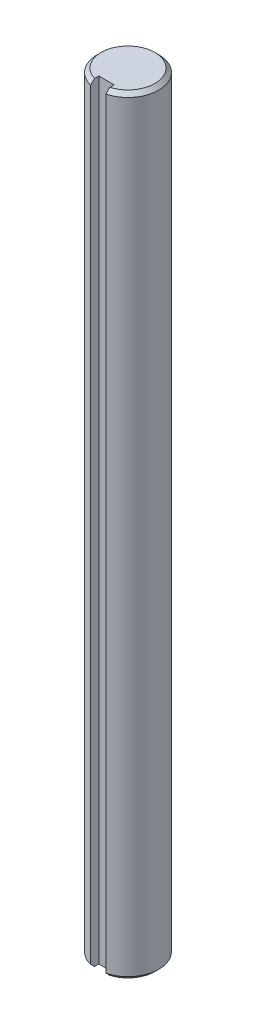
ISO-10303-21;
HEADER;
FILE_DESCRIPTION(('STEP AP214'),'2;1');
FILE_NAME('part.step','',(''),(''),'','','');
FILE_SCHEMA(('AUTOMOTIVE_DESIGN { 1 0 10303 214 1 1 1 1 }'));
ENDSEC;
DATA;
#1=APPLICATION_CONTEXT('core data for automotive mechanical design processes');
#2=APPLICATION_PROTOCOL_DEFINITION('international standard','automotive_design',2000,#1);
#3=PRODUCT_CONTEXT('',#1,'mechanical');
#4=PRODUCT('Part','Part','',(#3));
#5=PRODUCT_RELATED_PRODUCT_CATEGORY('part','',(#4));
#6=PRODUCT_DEFINITION_FORMATION('','',#4);
#7=PRODUCT_DEFINITION_CONTEXT('part definition',#1,'design');
#8=PRODUCT_DEFINITION('design','',#6,#7);
#9=PRODUCT_DEFINITION_SHAPE('','',#8);
#10=(LENGTH_UNIT() NAMED_UNIT(*) SI_UNIT(.MILLI.,.METRE.));
#11=(NAMED_UNIT(*) PLANE_ANGLE_UNIT() SI_UNIT($,.RADIAN.));
#12=(NAMED_UNIT(*) SI_UNIT($,.STERADIAN.) SOLID_ANGLE_UNIT());
#13=UNCERTAINTY_MEASURE_WITH_UNIT(LENGTH_MEASURE(1.E-05),#10,'distance_accuracy_value','');
#14=(GEOMETRIC_REPRESENTATION_CONTEXT(3) GLOBAL_UNCERTAINTY_ASSIGNED_CONTEXT((#13)) GLOBAL_UNIT_ASSIGNED_CONTEXT((#10,
#11,#12)) REPRESENTATION_CONTEXT('',''));
#15=CARTESIAN_POINT('',(0.,0.,0.));
#16=DIRECTION('',(0.,0.,1.));
#17=DIRECTION('',(1.,0.,0.));
#18=AXIS2_PLACEMENT_3D('',#15,#16,#17);
#19=CARTESIAN_POINT('',(0.,100.,0.));
#20=DIRECTION('',(0.,-1.,0.));
#21=DIRECTION('',(0.,0.,-1.));
#22=AXIS2_PLACEMENT_3D('',#19,#20,#21);
#23=CYLINDRICAL_SURFACE('',#22,4.);
#24=DIRECTION('',(0.,-1.,0.));
#25=VECTOR('',#24,1.);
#26=CARTESIAN_POINT('',(-1.,100.,3.87298334620742));
#27=LINE('',#26,#25);
#28=CARTESIAN_POINT('',(-1.,0.500000000000028,3.87298334620742));
#29=VERTEX_POINT('',#28);
#30=CARTESIAN_POINT('',(-1.,99.5,3.87298334620742));
#31=VERTEX_POINT('',#30);
#32=EDGE_CURVE('E121',#29,#31,#27,.F.);
#33=ORIENTED_EDGE('',*,*,#32,.T.);
#34=CARTESIAN_POINT('',(0.,99.5,0.));
#35=DIRECTION('',(0.,1.,0.));
#36=DIRECTION('',(0.,0.,1.));
#37=AXIS2_PLACEMENT_3D('',#34,#35,#36);
#38=CIRCLE('',#37,4.);
#39=CARTESIAN_POINT('',(1.,99.5,3.87298334620742));
#40=VERTEX_POINT('',#39);
#41=EDGE_CURVE('E178',#31,#40,#38,.F.);
#42=ORIENTED_EDGE('',*,*,#41,.T.);
#43=DIRECTION('',(0.,-1.,0.));
#44=VECTOR('',#43,1.);
#45=CARTESIAN_POINT('',(1.,100.,3.87298334620742));
#46=LINE('',#45,#44);
#47=CARTESIAN_POINT('',(1.,0.500000000000028,3.87298334620742));
#48=VERTEX_POINT('',#47);
#49=EDGE_CURVE('E118',#40,#48,#46,.T.);
#50=ORIENTED_EDGE('',*,*,#49,.T.);
#51=CARTESIAN_POINT('',(0.,0.500000000000028,0.));
#52=DIRECTION('',(0.,1.,0.));
#53=DIRECTION('',(0.,0.,1.));
#54=AXIS2_PLACEMENT_3D('',#51,#52,#53);
#55=CIRCLE('',#54,4.);
#56=EDGE_CURVE('E180',#48,#29,#55,.T.);
#57=ORIENTED_EDGE('',*,*,#56,.T.);
#58=EDGE_LOOP('',(#33,#42,#50,#57));
#59=FACE_BOUND('',#58,.T.);
#60=ADVANCED_FACE('F33',(#59),#23,.T.);
#61=CARTESIAN_POINT('',(0.,100.,0.));
#62=DIRECTION('',(0.,1.,0.));
#63=DIRECTION('',(0.,0.,1.));
#64=AXIS2_PLACEMENT_3D('',#61,#62,#63);
#65=PLANE('',#64);
#66=DIRECTION('',(0.,0.,1.));
#67=VECTOR('',#66,1.);
#68=CARTESIAN_POINT('',(1.,100.,2.8));
#69=LINE('',#68,#67);
#70=CARTESIAN_POINT('',(1.,100.,2.8));
#71=VERTEX_POINT('',#70);
#72=CARTESIAN_POINT('',(1.,100.,3.3541019662497));
#73=VERTEX_POINT('',#72);
#74=EDGE_CURVE('E108',#71,#73,#69,.T.);
#75=ORIENTED_EDGE('',*,*,#74,.T.);
#76=CARTESIAN_POINT('',(0.,100.,0.));
#77=DIRECTION('',(0.,1.,0.));
#78=DIRECTION('',(0.,0.,1.));
#79=AXIS2_PLACEMENT_3D('',#76,#77,#78);
#80=CIRCLE('',#79,3.50000000000002);
#81=CARTESIAN_POINT('',(-1.,100.,3.3541019662497));
#82=VERTEX_POINT('',#81);
#83=EDGE_CURVE('E96',#73,#82,#80,.T.);
#84=ORIENTED_EDGE('',*,*,#83,.T.);
#85=DIRECTION('',(0.,0.,-1.));
#86=VECTOR('',#85,1.);
#87=CARTESIAN_POINT('',(-1.,100.,2.8));
#88=LINE('',#87,#86);
#89=CARTESIAN_POINT('',(-1.,100.,2.8));
#90=VERTEX_POINT('',#89);
#91=EDGE_CURVE('E89',#82,#90,#88,.T.);
#92=ORIENTED_EDGE('',*,*,#91,.T.);
#93=DIRECTION('',(1.,0.,0.));
#94=VECTOR('',#93,1.);
#95=CARTESIAN_POINT('',(-1.,100.,2.8));
#96=LINE('',#95,#94);
#97=EDGE_CURVE('E94',#90,#71,#96,.T.);
#98=ORIENTED_EDGE('',*,*,#97,.T.);
#99=EDGE_LOOP('',(#75,#84,#92,#98));
#100=FACE_BOUND('',#99,.T.);
#101=ADVANCED_FACE('F92',(#100),#65,.T.);
#102=CARTESIAN_POINT('',(0.,0.,0.));
#103=DIRECTION('',(0.,1.,0.));
#104=DIRECTION('',(0.,0.,1.));
#105=AXIS2_PLACEMENT_3D('',#102,#103,#104);
#106=PLANE('',#105);
#107=DIRECTION('',(0.,0.,1.));
#108=VECTOR('',#107,1.);
#109=CARTESIAN_POINT('',(-1.,0.,0.));
#110=LINE('',#109,#108);
#111=CARTESIAN_POINT('',(-1.,0.,2.8));
#112=VERTEX_POINT('',#111);
#113=CARTESIAN_POINT('',(-1.,0.,3.35410196624967));
#114=VERTEX_POINT('',#113);
#115=EDGE_CURVE('E103',#112,#114,#110,.T.);
#116=ORIENTED_EDGE('',*,*,#115,.T.);
#117=CARTESIAN_POINT('',(0.,0.,0.));
#118=DIRECTION('',(0.,1.,0.));
#119=DIRECTION('',(0.,0.,1.));
#120=AXIS2_PLACEMENT_3D('',#117,#118,#119);
#121=CIRCLE('',#120,3.49999999999999);
#122=CARTESIAN_POINT('',(1.,0.,3.35410196624967));
#123=VERTEX_POINT('',#122);
#124=EDGE_CURVE('E11',#114,#123,#121,.F.);
#125=ORIENTED_EDGE('',*,*,#124,.T.);
#126=DIRECTION('',(0.,0.,1.));
#127=VECTOR('',#126,1.);
#128=CARTESIAN_POINT('',(1.,0.,2.8));
#129=LINE('',#128,#127);
#130=CARTESIAN_POINT('',(1.,0.,2.8));
#131=VERTEX_POINT('',#130);
#132=EDGE_CURVE('E98',#131,#123,#129,.T.);
#133=ORIENTED_EDGE('',*,*,#132,.F.);
#134=DIRECTION('',(1.,0.,0.));
#135=VECTOR('',#134,1.);
#136=CARTESIAN_POINT('',(-1.,0.,2.8));
#137=LINE('',#136,#135);
#138=EDGE_CURVE('E115',#112,#131,#137,.T.);
#139=ORIENTED_EDGE('',*,*,#138,.F.);
#140=EDGE_LOOP('',(#116,#125,#133,#139));
#141=FACE_BOUND('',#140,.T.);
#142=ADVANCED_FACE('F144',(#141),#106,.F.);
#143=CARTESIAN_POINT('',(-1.,100.,2.8));
#144=DIRECTION('',(-1.,0.,0.));
#145=DIRECTION('',(0.,0.,1.));
#146=AXIS2_PLACEMENT_3D('',#143,#144,#145);
#147=PLANE('',#146);
#148=ORIENTED_EDGE('',*,*,#91,.F.);
#149=CARTESIAN_POINT('',(-1.,100.,3.3541019662497));
#150=CARTESIAN_POINT('',(-1.,99.916888332204,3.44079581394296));
#151=CARTESIAN_POINT('',(-1.,99.8336658270636,3.52738285751032));
#152=CARTESIAN_POINT('',(-1.,99.6669991603484,3.70034331744943));
#153=CARTESIAN_POINT('',(-1.,99.5835549988221,3.78671673386798));
#154=CARTESIAN_POINT('',(-1.,99.5,3.87298334620741));
#155=B_SPLINE_CURVE_WITH_KNOTS('',3,(#149,#150,#151,#152,#153,#154),.UNSPECIFIED.,.F.,.F.,(4,2,
4),(0.,0.360291150710444,0.720582222497758),.UNSPECIFIED.);
#156=EDGE_CURVE('E133',#82,#31,#155,.T.);
#157=ORIENTED_EDGE('',*,*,#156,.T.);
#158=ORIENTED_EDGE('',*,*,#32,.F.);
#159=CARTESIAN_POINT('',(-1.,0.500000000000028,3.87298334620742));
#160=CARTESIAN_POINT('',(-1.,0.416445001177911,3.78671673386797));
#161=CARTESIAN_POINT('',(-1.,0.333000839651663,3.70034331744942));
#162=CARTESIAN_POINT('',(-1.,0.166334172936429,3.5273828575103));
#163=CARTESIAN_POINT('',(-1.,0.0831116677960003,3.44079581394293));
#164=CARTESIAN_POINT('',(-1.,0.,3.35410196624967));
#165=B_SPLINE_CURVE_WITH_KNOTS('',3,(#159,#160,#161,#162,#163,#164),.UNSPECIFIED.,.F.,.F.,(4,2,
4),(0.,0.360291071787348,0.72058222249781),.UNSPECIFIED.);
#166=EDGE_CURVE('E126',#29,#114,#165,.T.);
#167=ORIENTED_EDGE('',*,*,#166,.T.);
#168=ORIENTED_EDGE('',*,*,#115,.F.);
#169=DIRECTION('',(0.,-1.,0.));
#170=VECTOR('',#169,1.);
#171=CARTESIAN_POINT('',(-1.,100.,2.8));
#172=LINE('',#171,#170);
#173=EDGE_CURVE('E101',#90,#112,#172,.T.);
#174=ORIENTED_EDGE('',*,*,#173,.F.);
#175=EDGE_LOOP('',(#148,#157,#158,#167,#168,#174));
#176=FACE_BOUND('',#175,.T.);
#177=ADVANCED_FACE('F102',(#176),#147,.F.);
#178=CARTESIAN_POINT('',(1.,100.,2.8));
#179=DIRECTION('',(1.,0.,0.));
#180=DIRECTION('',(0.,0.,-1.));
#181=AXIS2_PLACEMENT_3D('',#178,#179,#180);
#182=PLANE('',#181);
#183=ORIENTED_EDGE('',*,*,#49,.F.);
#184=CARTESIAN_POINT('',(1.,99.5,3.87298334620742));
#185=CARTESIAN_POINT('',(1.,99.5835549988221,3.78671673386798));
#186=CARTESIAN_POINT('',(1.,99.6669991603484,3.70034331744943));
#187=CARTESIAN_POINT('',(1.,99.8336658270636,3.52738285751032));
#188=CARTESIAN_POINT('',(1.,99.916888332204,3.44079581394296));
#189=CARTESIAN_POINT('',(1.,100.,3.3541019662497));
#190=B_SPLINE_CURVE_WITH_KNOTS('',3,(#184,#185,#186,#187,#188,#189),.UNSPECIFIED.,.F.,.F.,(4,2,
4),(0.,0.360291071787317,0.720582222497761),.UNSPECIFIED.);
#191=EDGE_CURVE('E42',#40,#73,#190,.T.);
#192=ORIENTED_EDGE('',*,*,#191,.T.);
#193=ORIENTED_EDGE('',*,*,#74,.F.);
#194=DIRECTION('',(0.,-1.,0.));
#195=VECTOR('',#194,1.);
#196=CARTESIAN_POINT('',(1.,100.,2.8));
#197=LINE('',#196,#195);
#198=EDGE_CURVE('E107',#71,#131,#197,.T.);
#199=ORIENTED_EDGE('',*,*,#198,.T.);
#200=ORIENTED_EDGE('',*,*,#132,.T.);
#201=CARTESIAN_POINT('',(1.,0.,3.35410196624967));
#202=CARTESIAN_POINT('',(1.,0.0831116677960001,3.44079581394293));
#203=CARTESIAN_POINT('',(1.,0.166334172936428,3.5273828575103));
#204=CARTESIAN_POINT('',(1.,0.333000839651663,3.70034331744942));
#205=CARTESIAN_POINT('',(1.,0.416445001177911,3.78671673386797));
#206=CARTESIAN_POINT('',(1.,0.500000000000028,3.87298334620742));
#207=B_SPLINE_CURVE_WITH_KNOTS('',3,(#201,#202,#203,#204,#205,#206),.UNSPECIFIED.,.F.,.F.,(4,2,
4),(0.,0.360291150710462,0.72058222249781),.UNSPECIFIED.);
#208=EDGE_CURVE('E54',#123,#48,#207,.T.);
#209=ORIENTED_EDGE('',*,*,#208,.T.);
#210=EDGE_LOOP('',(#183,#192,#193,#199,#200,#209));
#211=FACE_BOUND('',#210,.T.);
#212=ADVANCED_FACE('F143',(#211),#182,.F.);
#213=CARTESIAN_POINT('',(-1.,100.,2.8));
#214=DIRECTION('',(0.,0.,-1.));
#215=DIRECTION('',(-1.,0.,0.));
#216=AXIS2_PLACEMENT_3D('',#213,#214,#215);
#217=PLANE('',#216);
#218=ORIENTED_EDGE('',*,*,#138,.T.);
#219=ORIENTED_EDGE('',*,*,#198,.F.);
#220=ORIENTED_EDGE('',*,*,#97,.F.);
#221=ORIENTED_EDGE('',*,*,#173,.T.);
#222=EDGE_LOOP('',(#218,#219,#220,#221));
#223=FACE_BOUND('',#222,.T.);
#224=ADVANCED_FACE('F110',(#223),#217,.F.);
#225=CARTESIAN_POINT('',(0.,100.,0.));
#226=DIRECTION('',(0.,-1.,0.));
#227=DIRECTION('',(0.,0.,-1.));
#228=AXIS2_PLACEMENT_3D('',#225,#226,#227);
#229=CONICAL_SURFACE('',#228,3.50000000000002,0.785398163397445);
#230=ORIENTED_EDGE('',*,*,#191,.F.);
#231=ORIENTED_EDGE('',*,*,#41,.F.);
#232=ORIENTED_EDGE('',*,*,#156,.F.);
#233=ORIENTED_EDGE('',*,*,#83,.F.);
#234=EDGE_LOOP('',(#230,#231,#232,#233));
#235=FACE_BOUND('',#234,.T.);
#236=ADVANCED_FACE('F153',(#235),#229,.T.);
#237=CARTESIAN_POINT('',(0.,0.500000000000028,0.));
#238=DIRECTION('',(0.,1.,0.));
#239=DIRECTION('',(0.,0.,1.));
#240=AXIS2_PLACEMENT_3D('',#237,#238,#239);
#241=CONICAL_SURFACE('',#240,4.,0.785398163397431);
#242=ORIENTED_EDGE('',*,*,#208,.F.);
#243=ORIENTED_EDGE('',*,*,#124,.F.);
#244=ORIENTED_EDGE('',*,*,#166,.F.);
#245=ORIENTED_EDGE('',*,*,#56,.F.);
#246=EDGE_LOOP('',(#242,#243,#244,#245));
#247=FACE_BOUND('',#246,.T.);
#248=ADVANCED_FACE('F35',(#247),#241,.T.);
#249=CLOSED_SHELL('',(#60,#101,#142,#177,#212,#224,#236,#248));
#250=MANIFOLD_SOLID_BREP('B2',#249);
#251=ADVANCED_BREP_SHAPE_REPRESENTATION('',(#18,#250),#14);
#252=SHAPE_DEFINITION_REPRESENTATION(#9,#251);
ENDSEC;
END-ISO-10303-21;
